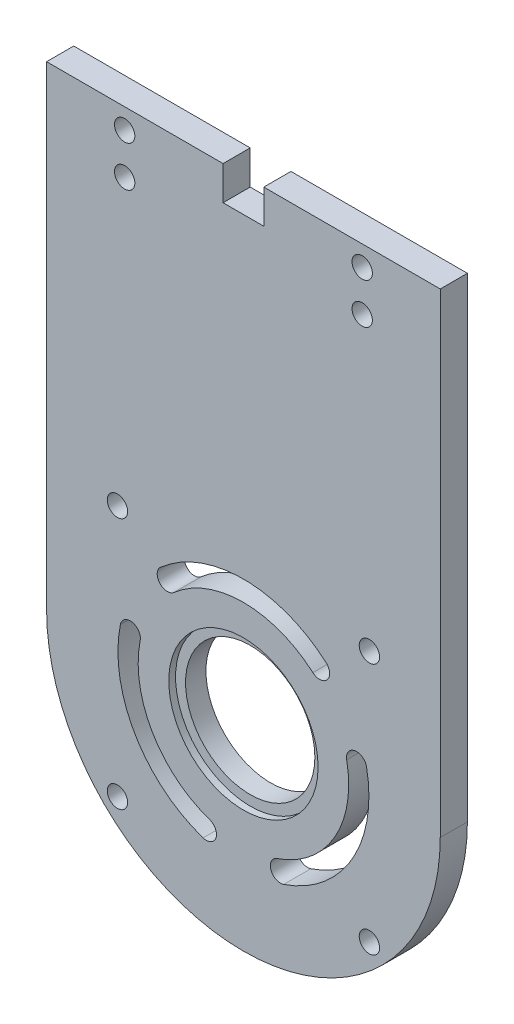
ISO-10303-21;
HEADER;
FILE_DESCRIPTION(('STEP AP214'),'2;1');
FILE_NAME('part.step','',(''),(''),'','','');
FILE_SCHEMA(('AUTOMOTIVE_DESIGN { 1 0 10303 214 1 1 1 1 }'));
ENDSEC;
DATA;
#1=APPLICATION_CONTEXT('core data for automotive mechanical design processes');
#2=APPLICATION_PROTOCOL_DEFINITION('international standard','automotive_design',2000,#1);
#3=PRODUCT_CONTEXT('',#1,'mechanical');
#4=PRODUCT('Part','Part','',(#3));
#5=PRODUCT_RELATED_PRODUCT_CATEGORY('part','',(#4));
#6=PRODUCT_DEFINITION_FORMATION('','',#4);
#7=PRODUCT_DEFINITION_CONTEXT('part definition',#1,'design');
#8=PRODUCT_DEFINITION('design','',#6,#7);
#9=PRODUCT_DEFINITION_SHAPE('','',#8);
#10=(LENGTH_UNIT() NAMED_UNIT(*) SI_UNIT(.MILLI.,.METRE.));
#11=(NAMED_UNIT(*) PLANE_ANGLE_UNIT() SI_UNIT($,.RADIAN.));
#12=(NAMED_UNIT(*) SI_UNIT($,.STERADIAN.) SOLID_ANGLE_UNIT());
#13=UNCERTAINTY_MEASURE_WITH_UNIT(LENGTH_MEASURE(1.E-05),#10,'distance_accuracy_value','');
#14=(GEOMETRIC_REPRESENTATION_CONTEXT(3) GLOBAL_UNCERTAINTY_ASSIGNED_CONTEXT((#13)) GLOBAL_UNIT_ASSIGNED_CONTEXT((#10,
#11,#12)) REPRESENTATION_CONTEXT('',''));
#15=CARTESIAN_POINT('',(0.,0.,0.));
#16=DIRECTION('',(0.,0.,1.));
#17=DIRECTION('',(1.,0.,0.));
#18=AXIS2_PLACEMENT_3D('',#15,#16,#17);
#19=CARTESIAN_POINT('',(0.,-64.,4.));
#20=DIRECTION('',(0.,0.,-1.));
#21=DIRECTION('',(-1.,0.,0.));
#22=AXIS2_PLACEMENT_3D('',#19,#20,#21);
#23=CYLINDRICAL_SURFACE('',#22,9.525);
#24=CARTESIAN_POINT('',(0.,-64.,0.));
#25=DIRECTION('',(0.,0.,1.));
#26=DIRECTION('',(1.,0.,0.));
#27=AXIS2_PLACEMENT_3D('',#24,#25,#26);
#28=CIRCLE('',#27,9.525);
#29=CARTESIAN_POINT('',(9.525,-64.,0.));
#30=VERTEX_POINT('',#29);
#31=EDGE_CURVE('E321',#30,#30,#28,.T.);
#32=ORIENTED_EDGE('',*,*,#31,.F.);
#33=EDGE_LOOP('',(#32));
#34=FACE_BOUND('',#33,.T.);
#35=CARTESIAN_POINT('',(0.,-64.,3.));
#36=DIRECTION('',(0.,0.,1.));
#37=DIRECTION('',(1.,0.,0.));
#38=AXIS2_PLACEMENT_3D('',#35,#36,#37);
#39=CIRCLE('',#38,9.525);
#40=CARTESIAN_POINT('',(9.525,-64.,3.));
#41=VERTEX_POINT('',#40);
#42=EDGE_CURVE('E47',#41,#41,#39,.T.);
#43=ORIENTED_EDGE('',*,*,#42,.T.);
#44=EDGE_LOOP('',(#43));
#45=FACE_BOUND('',#44,.T.);
#46=ADVANCED_FACE('F44',(#34,#45),#23,.F.);
#47=CARTESIAN_POINT('',(0.,6.,4.));
#48=DIRECTION('',(0.,1.,0.));
#49=DIRECTION('',(0.,0.,1.));
#50=AXIS2_PLACEMENT_3D('',#47,#48,#49);
#51=PLANE('',#50);
#52=DIRECTION('',(0.,0.,1.));
#53=VECTOR('',#52,1.);
#54=CARTESIAN_POINT('',(-3.,6.,0.));
#55=LINE('',#54,#53);
#56=CARTESIAN_POINT('',(-3.,6.,0.));
#57=VERTEX_POINT('',#56);
#58=CARTESIAN_POINT('',(-3.,6.,4.));
#59=VERTEX_POINT('',#58);
#60=EDGE_CURVE('E275',#57,#59,#55,.T.);
#61=ORIENTED_EDGE('',*,*,#60,.F.);
#62=DIRECTION('',(1.,0.,0.));
#63=VECTOR('',#62,1.);
#64=CARTESIAN_POINT('',(0.,6.,0.));
#65=LINE('',#64,#63);
#66=CARTESIAN_POINT('',(-29.,6.,0.));
#67=VERTEX_POINT('',#66);
#68=EDGE_CURVE('E340',#67,#57,#65,.T.);
#69=ORIENTED_EDGE('',*,*,#68,.F.);
#70=DIRECTION('',(0.,0.,-1.));
#71=VECTOR('',#70,1.);
#72=CARTESIAN_POINT('',(-29.,6.,4.));
#73=LINE('',#72,#71);
#74=CARTESIAN_POINT('',(-29.,6.,4.));
#75=VERTEX_POINT('',#74);
#76=EDGE_CURVE('E319',#75,#67,#73,.T.);
#77=ORIENTED_EDGE('',*,*,#76,.F.);
#78=DIRECTION('',(1.,0.,0.));
#79=VECTOR('',#78,1.);
#80=CARTESIAN_POINT('',(0.,6.,4.));
#81=LINE('',#80,#79);
#82=EDGE_CURVE('E300',#75,#59,#81,.T.);
#83=ORIENTED_EDGE('',*,*,#82,.T.);
#84=EDGE_LOOP('',(#61,#69,#77,#83));
#85=FACE_BOUND('',#84,.T.);
#86=ADVANCED_FACE('F414',(#85),#51,.T.);
#87=CARTESIAN_POINT('',(-29.,0.,4.));
#88=DIRECTION('',(1.,0.,0.));
#89=DIRECTION('',(0.,1.,0.));
#90=AXIS2_PLACEMENT_3D('',#87,#88,#89);
#91=PLANE('',#90);
#92=DIRECTION('',(0.,-1.,0.));
#93=VECTOR('',#92,1.);
#94=CARTESIAN_POINT('',(-29.,0.,0.));
#95=LINE('',#94,#93);
#96=CARTESIAN_POINT('',(-29.,-64.,0.));
#97=VERTEX_POINT('',#96);
#98=EDGE_CURVE('E330',#67,#97,#95,.T.);
#99=ORIENTED_EDGE('',*,*,#98,.T.);
#100=DIRECTION('',(0.,0.,-1.));
#101=VECTOR('',#100,1.);
#102=CARTESIAN_POINT('',(-29.,-64.,4.));
#103=LINE('',#102,#101);
#104=CARTESIAN_POINT('',(-29.,-64.,4.));
#105=VERTEX_POINT('',#104);
#106=EDGE_CURVE('E361',#105,#97,#103,.T.);
#107=ORIENTED_EDGE('',*,*,#106,.F.);
#108=DIRECTION('',(0.,-1.,0.));
#109=VECTOR('',#108,1.);
#110=CARTESIAN_POINT('',(-29.,0.,4.));
#111=LINE('',#110,#109);
#112=EDGE_CURVE('E290',#75,#105,#111,.T.);
#113=ORIENTED_EDGE('',*,*,#112,.F.);
#114=ORIENTED_EDGE('',*,*,#76,.T.);
#115=EDGE_LOOP('',(#99,#107,#113,#114));
#116=FACE_BOUND('',#115,.T.);
#117=ADVANCED_FACE('F421',(#116),#91,.F.);
#118=CARTESIAN_POINT('',(0.,-64.,4.));
#119=DIRECTION('',(0.,0.,-1.));
#120=DIRECTION('',(-1.,0.,0.));
#121=AXIS2_PLACEMENT_3D('',#118,#119,#120);
#122=CYLINDRICAL_SURFACE('',#121,29.);
#123=CARTESIAN_POINT('',(0.,-64.,0.));
#124=DIRECTION('',(0.,0.,1.));
#125=DIRECTION('',(1.,0.,0.));
#126=AXIS2_PLACEMENT_3D('',#123,#124,#125);
#127=CIRCLE('',#126,29.);
#128=CARTESIAN_POINT('',(29.,-64.,0.));
#129=VERTEX_POINT('',#128);
#130=EDGE_CURVE('E329',#97,#129,#127,.T.);
#131=ORIENTED_EDGE('',*,*,#130,.T.);
#132=DIRECTION('',(0.,0.,-1.));
#133=VECTOR('',#132,1.);
#134=CARTESIAN_POINT('',(29.,-64.,4.));
#135=LINE('',#134,#133);
#136=CARTESIAN_POINT('',(29.,-64.,4.));
#137=VERTEX_POINT('',#136);
#138=EDGE_CURVE('E363',#137,#129,#135,.T.);
#139=ORIENTED_EDGE('',*,*,#138,.F.);
#140=CARTESIAN_POINT('',(0.,-64.,4.));
#141=DIRECTION('',(0.,0.,1.));
#142=DIRECTION('',(1.,0.,0.));
#143=AXIS2_PLACEMENT_3D('',#140,#141,#142);
#144=CIRCLE('',#143,29.);
#145=EDGE_CURVE('E293',#105,#137,#144,.T.);
#146=ORIENTED_EDGE('',*,*,#145,.F.);
#147=ORIENTED_EDGE('',*,*,#106,.T.);
#148=EDGE_LOOP('',(#131,#139,#146,#147));
#149=FACE_BOUND('',#148,.T.);
#150=ADVANCED_FACE('F491',(#149),#122,.T.);
#151=CARTESIAN_POINT('',(29.,0.,4.));
#152=DIRECTION('',(1.,0.,0.));
#153=DIRECTION('',(0.,1.,0.));
#154=AXIS2_PLACEMENT_3D('',#151,#152,#153);
#155=PLANE('',#154);
#156=DIRECTION('',(0.,-1.,0.));
#157=VECTOR('',#156,1.);
#158=CARTESIAN_POINT('',(29.,0.,0.));
#159=LINE('',#158,#157);
#160=CARTESIAN_POINT('',(29.,6.,0.));
#161=VERTEX_POINT('',#160);
#162=EDGE_CURVE('E335',#161,#129,#159,.T.);
#163=ORIENTED_EDGE('',*,*,#162,.F.);
#164=DIRECTION('',(0.,0.,-1.));
#165=VECTOR('',#164,1.);
#166=CARTESIAN_POINT('',(29.,6.,4.));
#167=LINE('',#166,#165);
#168=CARTESIAN_POINT('',(29.,6.,4.));
#169=VERTEX_POINT('',#168);
#170=EDGE_CURVE('E356',#169,#161,#167,.T.);
#171=ORIENTED_EDGE('',*,*,#170,.F.);
#172=DIRECTION('',(0.,-1.,0.));
#173=VECTOR('',#172,1.);
#174=CARTESIAN_POINT('',(29.,0.,4.));
#175=LINE('',#174,#173);
#176=EDGE_CURVE('E291',#169,#137,#175,.T.);
#177=ORIENTED_EDGE('',*,*,#176,.T.);
#178=ORIENTED_EDGE('',*,*,#138,.T.);
#179=EDGE_LOOP('',(#163,#171,#177,#178));
#180=FACE_BOUND('',#179,.T.);
#181=ADVANCED_FACE('F480',(#180),#155,.T.);
#182=CARTESIAN_POINT('',(-17.4999999999999,-3.,4.));
#183=DIRECTION('',(0.,0.,-1.));
#184=DIRECTION('',(-1.,0.,0.));
#185=AXIS2_PLACEMENT_3D('',#182,#183,#184);
#186=CYLINDRICAL_SURFACE('',#185,1.5);
#187=CARTESIAN_POINT('',(-17.4999999999999,-3.,4.));
#188=DIRECTION('',(0.,0.,1.));
#189=DIRECTION('',(1.,0.,0.));
#190=AXIS2_PLACEMENT_3D('',#187,#188,#189);
#191=CIRCLE('',#190,1.5);
#192=CARTESIAN_POINT('',(-15.9999999999999,-3.,4.));
#193=VERTEX_POINT('',#192);
#194=EDGE_CURVE('E315',#193,#193,#191,.T.);
#195=ORIENTED_EDGE('',*,*,#194,.T.);
#196=EDGE_LOOP('',(#195));
#197=FACE_BOUND('',#196,.T.);
#198=CARTESIAN_POINT('',(-17.4999999999999,-3.,0.));
#199=DIRECTION('',(0.,0.,1.));
#200=DIRECTION('',(1.,0.,0.));
#201=AXIS2_PLACEMENT_3D('',#198,#199,#200);
#202=CIRCLE('',#201,1.5);
#203=CARTESIAN_POINT('',(-15.9999999999999,-3.,0.));
#204=VERTEX_POINT('',#203);
#205=EDGE_CURVE('E354',#204,#204,#202,.T.);
#206=ORIENTED_EDGE('',*,*,#205,.F.);
#207=EDGE_LOOP('',(#206));
#208=FACE_BOUND('',#207,.T.);
#209=ADVANCED_FACE('F474',(#197,#208),#186,.F.);
#210=CARTESIAN_POINT('',(18.5615530061469,-45.4384469938532,4.));
#211=DIRECTION('',(0.,0.,-1.));
#212=DIRECTION('',(-1.,0.,0.));
#213=AXIS2_PLACEMENT_3D('',#210,#211,#212);
#214=CYLINDRICAL_SURFACE('',#213,1.5);
#215=CARTESIAN_POINT('',(18.5615530061469,-45.4384469938532,4.));
#216=DIRECTION('',(0.,0.,1.));
#217=DIRECTION('',(1.,0.,0.));
#218=AXIS2_PLACEMENT_3D('',#215,#216,#217);
#219=CIRCLE('',#218,1.5);
#220=CARTESIAN_POINT('',(20.0615530061469,-45.4384469938532,4.));
#221=VERTEX_POINT('',#220);
#222=EDGE_CURVE('E307',#221,#221,#219,.T.);
#223=ORIENTED_EDGE('',*,*,#222,.T.);
#224=EDGE_LOOP('',(#223));
#225=FACE_BOUND('',#224,.T.);
#226=CARTESIAN_POINT('',(18.5615530061469,-45.4384469938532,0.));
#227=DIRECTION('',(0.,0.,1.));
#228=DIRECTION('',(1.,0.,0.));
#229=AXIS2_PLACEMENT_3D('',#226,#227,#228);
#230=CIRCLE('',#229,1.5);
#231=CARTESIAN_POINT('',(20.0615530061469,-45.4384469938532,0.));
#232=VERTEX_POINT('',#231);
#233=EDGE_CURVE('E348',#232,#232,#230,.T.);
#234=ORIENTED_EDGE('',*,*,#233,.F.);
#235=EDGE_LOOP('',(#234));
#236=FACE_BOUND('',#235,.T.);
#237=ADVANCED_FACE('F476',(#225,#236),#214,.F.);
#238=CARTESIAN_POINT('',(-18.5615530061468,-45.4384469938531,4.));
#239=DIRECTION('',(0.,0.,-1.));
#240=DIRECTION('',(-1.,0.,0.));
#241=AXIS2_PLACEMENT_3D('',#238,#239,#240);
#242=CYLINDRICAL_SURFACE('',#241,1.5);
#243=CARTESIAN_POINT('',(-18.5615530061468,-45.4384469938531,4.));
#244=DIRECTION('',(0.,0.,1.));
#245=DIRECTION('',(1.,0.,0.));
#246=AXIS2_PLACEMENT_3D('',#243,#244,#245);
#247=CIRCLE('',#246,1.5);
#248=CARTESIAN_POINT('',(-17.0615530061468,-45.4384469938531,4.));
#249=VERTEX_POINT('',#248);
#250=EDGE_CURVE('E306',#249,#249,#247,.T.);
#251=ORIENTED_EDGE('',*,*,#250,.T.);
#252=EDGE_LOOP('',(#251));
#253=FACE_BOUND('',#252,.T.);
#254=CARTESIAN_POINT('',(-18.5615530061468,-45.4384469938531,0.));
#255=DIRECTION('',(0.,0.,1.));
#256=DIRECTION('',(1.,0.,0.));
#257=AXIS2_PLACEMENT_3D('',#254,#255,#256);
#258=CIRCLE('',#257,1.5);
#259=CARTESIAN_POINT('',(-17.0615530061468,-45.4384469938531,0.));
#260=VERTEX_POINT('',#259);
#261=EDGE_CURVE('E346',#260,#260,#258,.T.);
#262=ORIENTED_EDGE('',*,*,#261,.F.);
#263=EDGE_LOOP('',(#262));
#264=FACE_BOUND('',#263,.T.);
#265=ADVANCED_FACE('F482',(#253,#264),#242,.F.);
#266=CARTESIAN_POINT('',(-18.5615530061469,-82.5615530061468,4.));
#267=DIRECTION('',(0.,0.,-1.));
#268=DIRECTION('',(-1.,0.,0.));
#269=AXIS2_PLACEMENT_3D('',#266,#267,#268);
#270=CYLINDRICAL_SURFACE('',#269,1.49999999999999);
#271=CARTESIAN_POINT('',(-18.5615530061469,-82.5615530061468,4.));
#272=DIRECTION('',(0.,0.,1.));
#273=DIRECTION('',(1.,0.,0.));
#274=AXIS2_PLACEMENT_3D('',#271,#272,#273);
#275=CIRCLE('',#274,1.49999999999999);
#276=CARTESIAN_POINT('',(-17.0615530061469,-82.5615530061468,4.));
#277=VERTEX_POINT('',#276);
#278=EDGE_CURVE('E303',#277,#277,#275,.T.);
#279=ORIENTED_EDGE('',*,*,#278,.T.);
#280=EDGE_LOOP('',(#279));
#281=FACE_BOUND('',#280,.T.);
#282=CARTESIAN_POINT('',(-18.5615530061469,-82.5615530061468,0.));
#283=DIRECTION('',(0.,0.,1.));
#284=DIRECTION('',(1.,0.,0.));
#285=AXIS2_PLACEMENT_3D('',#282,#283,#284);
#286=CIRCLE('',#285,1.49999999999999);
#287=CARTESIAN_POINT('',(-17.0615530061469,-82.5615530061468,0.));
#288=VERTEX_POINT('',#287);
#289=EDGE_CURVE('E344',#288,#288,#286,.T.);
#290=ORIENTED_EDGE('',*,*,#289,.F.);
#291=EDGE_LOOP('',(#290));
#292=FACE_BOUND('',#291,.T.);
#293=ADVANCED_FACE('F483',(#281,#292),#270,.F.);
#294=CARTESIAN_POINT('',(18.5615530061468,-82.5615530061469,4.));
#295=DIRECTION('',(0.,0.,-1.));
#296=DIRECTION('',(-1.,0.,0.));
#297=AXIS2_PLACEMENT_3D('',#294,#295,#296);
#298=CYLINDRICAL_SURFACE('',#297,1.50000000000001);
#299=CARTESIAN_POINT('',(18.5615530061468,-82.5615530061469,4.));
#300=DIRECTION('',(0.,0.,1.));
#301=DIRECTION('',(1.,0.,0.));
#302=AXIS2_PLACEMENT_3D('',#299,#300,#301);
#303=CIRCLE('',#302,1.50000000000001);
#304=CARTESIAN_POINT('',(20.0615530061469,-82.5615530061469,4.));
#305=VERTEX_POINT('',#304);
#306=EDGE_CURVE('E297',#305,#305,#303,.T.);
#307=ORIENTED_EDGE('',*,*,#306,.T.);
#308=EDGE_LOOP('',(#307));
#309=FACE_BOUND('',#308,.T.);
#310=CARTESIAN_POINT('',(18.5615530061468,-82.5615530061469,0.));
#311=DIRECTION('',(0.,0.,1.));
#312=DIRECTION('',(1.,0.,0.));
#313=AXIS2_PLACEMENT_3D('',#310,#311,#312);
#314=CIRCLE('',#313,1.50000000000001);
#315=CARTESIAN_POINT('',(20.0615530061469,-82.5615530061469,0.));
#316=VERTEX_POINT('',#315);
#317=EDGE_CURVE('E338',#316,#316,#314,.T.);
#318=ORIENTED_EDGE('',*,*,#317,.F.);
#319=EDGE_LOOP('',(#318));
#320=FACE_BOUND('',#319,.T.);
#321=ADVANCED_FACE('F441',(#309,#320),#298,.F.);
#322=DIRECTION('',(0.,0.,1.));
#323=VECTOR('',#322,1.);
#324=CARTESIAN_POINT('',(3.,6.,0.));
#325=LINE('',#324,#323);
#326=CARTESIAN_POINT('',(3.,6.,0.));
#327=VERTEX_POINT('',#326);
#328=CARTESIAN_POINT('',(3.,6.,4.));
#329=VERTEX_POINT('',#328);
#330=EDGE_CURVE('E273',#327,#329,#325,.T.);
#331=ORIENTED_EDGE('',*,*,#330,.T.);
#332=EDGE_CURVE('E298',#329,#169,#81,.T.);
#333=ORIENTED_EDGE('',*,*,#332,.T.);
#334=ORIENTED_EDGE('',*,*,#170,.T.);
#335=EDGE_CURVE('E337',#327,#161,#65,.T.);
#336=ORIENTED_EDGE('',*,*,#335,.F.);
#337=EDGE_LOOP('',(#331,#333,#334,#336));
#338=FACE_BOUND('',#337,.T.);
#339=ADVANCED_FACE('F428',(#338),#51,.T.);
#340=CARTESIAN_POINT('',(-17.5,3.,4.));
#341=DIRECTION('',(0.,0.,-1.));
#342=DIRECTION('',(-1.,0.,0.));
#343=AXIS2_PLACEMENT_3D('',#340,#341,#342);
#344=CYLINDRICAL_SURFACE('',#343,1.5);
#345=CARTESIAN_POINT('',(-17.5,3.,4.));
#346=DIRECTION('',(0.,0.,1.));
#347=DIRECTION('',(1.,0.,0.));
#348=AXIS2_PLACEMENT_3D('',#345,#346,#347);
#349=CIRCLE('',#348,1.5);
#350=CARTESIAN_POINT('',(-16.,3.,4.));
#351=VERTEX_POINT('',#350);
#352=EDGE_CURVE('E283',#351,#351,#349,.T.);
#353=ORIENTED_EDGE('',*,*,#352,.T.);
#354=EDGE_LOOP('',(#353));
#355=FACE_BOUND('',#354,.T.);
#356=CARTESIAN_POINT('',(-17.5,3.,0.));
#357=DIRECTION('',(0.,0.,1.));
#358=DIRECTION('',(1.,0.,0.));
#359=AXIS2_PLACEMENT_3D('',#356,#357,#358);
#360=CIRCLE('',#359,1.5);
#361=CARTESIAN_POINT('',(-16.,3.,0.));
#362=VERTEX_POINT('',#361);
#363=EDGE_CURVE('E322',#362,#362,#360,.T.);
#364=ORIENTED_EDGE('',*,*,#363,.F.);
#365=EDGE_LOOP('',(#364));
#366=FACE_BOUND('',#365,.T.);
#367=ADVANCED_FACE('F431',(#355,#366),#344,.F.);
#368=CARTESIAN_POINT('',(17.5,3.,4.));
#369=DIRECTION('',(0.,0.,-1.));
#370=DIRECTION('',(-1.,0.,0.));
#371=AXIS2_PLACEMENT_3D('',#368,#369,#370);
#372=CYLINDRICAL_SURFACE('',#371,1.5);
#373=CARTESIAN_POINT('',(17.5,3.,4.));
#374=DIRECTION('',(0.,0.,1.));
#375=DIRECTION('',(1.,0.,0.));
#376=AXIS2_PLACEMENT_3D('',#373,#374,#375);
#377=CIRCLE('',#376,1.5);
#378=CARTESIAN_POINT('',(19.,3.,4.));
#379=VERTEX_POINT('',#378);
#380=EDGE_CURVE('E281',#379,#379,#377,.F.);
#381=ORIENTED_EDGE('',*,*,#380,.F.);
#382=EDGE_LOOP('',(#381));
#383=FACE_BOUND('',#382,.T.);
#384=CARTESIAN_POINT('',(17.5,3.,0.));
#385=DIRECTION('',(0.,0.,1.));
#386=DIRECTION('',(1.,0.,0.));
#387=AXIS2_PLACEMENT_3D('',#384,#385,#386);
#388=CIRCLE('',#387,1.5);
#389=CARTESIAN_POINT('',(19.,3.,0.));
#390=VERTEX_POINT('',#389);
#391=EDGE_CURVE('E274',#390,#390,#388,.F.);
#392=ORIENTED_EDGE('',*,*,#391,.T.);
#393=EDGE_LOOP('',(#392));
#394=FACE_BOUND('',#393,.T.);
#395=ADVANCED_FACE('F50',(#383,#394),#372,.F.);
#396=CARTESIAN_POINT('',(17.5000000000001,-3.,4.));
#397=DIRECTION('',(0.,0.,-1.));
#398=DIRECTION('',(-1.,0.,0.));
#399=AXIS2_PLACEMENT_3D('',#396,#397,#398);
#400=CYLINDRICAL_SURFACE('',#399,1.5);
#401=CARTESIAN_POINT('',(17.5000000000001,-3.,4.));
#402=DIRECTION('',(0.,0.,1.));
#403=DIRECTION('',(1.,0.,0.));
#404=AXIS2_PLACEMENT_3D('',#401,#402,#403);
#405=CIRCLE('',#404,1.5);
#406=CARTESIAN_POINT('',(19.0000000000001,-3.,4.));
#407=VERTEX_POINT('',#406);
#408=EDGE_CURVE('E314',#407,#407,#405,.F.);
#409=ORIENTED_EDGE('',*,*,#408,.F.);
#410=EDGE_LOOP('',(#409));
#411=FACE_BOUND('',#410,.T.);
#412=CARTESIAN_POINT('',(17.5000000000001,-3.,0.));
#413=DIRECTION('',(0.,0.,1.));
#414=DIRECTION('',(1.,0.,0.));
#415=AXIS2_PLACEMENT_3D('',#412,#413,#414);
#416=CIRCLE('',#415,1.5);
#417=CARTESIAN_POINT('',(19.0000000000001,-3.,0.));
#418=VERTEX_POINT('',#417);
#419=EDGE_CURVE('E284',#418,#418,#416,.F.);
#420=ORIENTED_EDGE('',*,*,#419,.T.);
#421=EDGE_LOOP('',(#420));
#422=FACE_BOUND('',#421,.T.);
#423=ADVANCED_FACE('F438',(#411,#422),#400,.F.);
#424=CARTESIAN_POINT('',(0.,0.,4.));
#425=DIRECTION('',(0.,0.,1.));
#426=DIRECTION('',(1.,0.,0.));
#427=AXIS2_PLACEMENT_3D('',#424,#425,#426);
#428=PLANE('',#427);
#429=CARTESIAN_POINT('',(0.,-64.,4.));
#430=DIRECTION('',(0.,0.,1.));
#431=DIRECTION('',(1.,0.,0.));
#432=AXIS2_PLACEMENT_3D('',#429,#430,#431);
#433=CIRCLE('',#432,11.);
#434=CARTESIAN_POINT('',(11.,-64.,4.));
#435=VERTEX_POINT('',#434);
#436=EDGE_CURVE('E652',#435,#435,#433,.T.);
#437=ORIENTED_EDGE('',*,*,#436,.F.);
#438=EDGE_LOOP('',(#437));
#439=FACE_BOUND('',#438,.T.);
#440=CARTESIAN_POINT('',(11.2135824426123,-51.2228497385866,4.));
#441=DIRECTION('',(0.,0.,1.));
#442=DIRECTION('',(1.,0.,0.));
#443=AXIS2_PLACEMENT_3D('',#440,#441,#442);
#444=CIRCLE('',#443,1.48958473448185);
#445=CARTESIAN_POINT('',(10.23101884112,-52.3424172667973,4.));
#446=VERTEX_POINT('',#445);
#447=CARTESIAN_POINT('',(12.1961460441046,-50.1032822103759,4.));
#448=VERTEX_POINT('',#447);
#449=EDGE_CURVE('E62',#446,#448,#444,.T.);
#450=ORIENTED_EDGE('',*,*,#449,.F.);
#451=CARTESIAN_POINT('',(0.,-64.,4.));
#452=DIRECTION('',(0.,0.,-1.));
#453=DIRECTION('',(1.,0.,0.));
#454=AXIS2_PLACEMENT_3D('',#451,#452,#453);
#455=CIRCLE('',#454,15.5104152655182);
#456=CARTESIAN_POINT('',(-10.23101884112,-52.3424172667973,4.));
#457=VERTEX_POINT('',#456);
#458=EDGE_CURVE('E210',#457,#446,#455,.T.);
#459=ORIENTED_EDGE('',*,*,#458,.F.);
#460=CARTESIAN_POINT('',(-11.2135824426123,-51.2228497385866,4.));
#461=DIRECTION('',(0.,0.,1.));
#462=DIRECTION('',(1.,0.,0.));
#463=AXIS2_PLACEMENT_3D('',#460,#461,#462);
#464=CIRCLE('',#463,1.48958473448185);
#465=CARTESIAN_POINT('',(-12.1961460441046,-50.1032822103759,4.));
#466=VERTEX_POINT('',#465);
#467=EDGE_CURVE('E188',#466,#457,#464,.T.);
#468=ORIENTED_EDGE('',*,*,#467,.F.);
#469=CARTESIAN_POINT('',(0.,-64.,4.));
#470=DIRECTION('',(0.,0.,1.));
#471=DIRECTION('',(1.,0.,0.));
#472=AXIS2_PLACEMENT_3D('',#469,#470,#471);
#473=CIRCLE('',#472,18.4895847344819);
#474=EDGE_CURVE('E199',#448,#466,#473,.T.);
#475=ORIENTED_EDGE('',*,*,#474,.F.);
#476=EDGE_LOOP('',(#450,#459,#468,#475));
#477=FACE_BOUND('',#476,.T.);
#478=CARTESIAN_POINT('',(5.45854549304885,-80.0998223934401,4.));
#479=DIRECTION('',(0.,0.,1.));
#480=DIRECTION('',(1.,0.,0.));
#481=AXIS2_PLACEMENT_3D('',#478,#479,#480);
#482=CIRCLE('',#481,1.48958473448186);
#483=CARTESIAN_POINT('',(4.98025337311236,-78.6891135896085,4.));
#484=VERTEX_POINT('',#483);
#485=CARTESIAN_POINT('',(5.93683761298532,-81.5105311972718,4.));
#486=VERTEX_POINT('',#485);
#487=EDGE_CURVE('E68',#484,#486,#482,.T.);
#488=ORIENTED_EDGE('',*,*,#487,.F.);
#489=CARTESIAN_POINT('',(0.,-64.,4.));
#490=DIRECTION('',(0.,0.,-1.));
#491=DIRECTION('',(1.,0.,0.));
#492=AXIS2_PLACEMENT_3D('',#489,#490,#491);
#493=CIRCLE('',#492,15.5104152655181);
#494=CARTESIAN_POINT('',(15.2112722142324,-60.9684691435942,4.));
#495=VERTEX_POINT('',#494);
#496=EDGE_CURVE('E218',#495,#484,#493,.T.);
#497=ORIENTED_EDGE('',*,*,#496,.F.);
#498=CARTESIAN_POINT('',(16.6721279356612,-60.6773278679733,4.));
#499=DIRECTION('',(0.,0.,1.));
#500=DIRECTION('',(1.,0.,0.));
#501=AXIS2_PLACEMENT_3D('',#498,#499,#500);
#502=CIRCLE('',#501,1.48958473448185);
#503=CARTESIAN_POINT('',(18.1329836570899,-60.3861865923524,4.));
#504=VERTEX_POINT('',#503);
#505=EDGE_CURVE('E230',#504,#495,#502,.T.);
#506=ORIENTED_EDGE('',*,*,#505,.F.);
#507=CARTESIAN_POINT('',(0.,-64.,4.));
#508=DIRECTION('',(0.,0.,1.));
#509=DIRECTION('',(1.,0.,0.));
#510=AXIS2_PLACEMENT_3D('',#507,#508,#509);
#511=CIRCLE('',#510,18.4895847344819);
#512=EDGE_CURVE('E235',#486,#504,#511,.T.);
#513=ORIENTED_EDGE('',*,*,#512,.F.);
#514=EDGE_LOOP('',(#488,#497,#506,#513));
#515=FACE_BOUND('',#514,.T.);
#516=CARTESIAN_POINT('',(-16.6721279356612,-60.6773278679733,4.));
#517=DIRECTION('',(0.,0.,1.));
#518=DIRECTION('',(1.,0.,0.));
#519=AXIS2_PLACEMENT_3D('',#516,#517,#518);
#520=CIRCLE('',#519,1.48958473448185);
#521=CARTESIAN_POINT('',(-15.2112722142324,-60.9684691435942,4.));
#522=VERTEX_POINT('',#521);
#523=CARTESIAN_POINT('',(-18.1329836570899,-60.3861865923524,4.));
#524=VERTEX_POINT('',#523);
#525=EDGE_CURVE('E228',#522,#524,#520,.T.);
#526=ORIENTED_EDGE('',*,*,#525,.F.);
#527=CARTESIAN_POINT('',(0.,-64.,4.));
#528=DIRECTION('',(0.,0.,-1.));
#529=DIRECTION('',(1.,0.,0.));
#530=AXIS2_PLACEMENT_3D('',#527,#528,#529);
#531=CIRCLE('',#530,15.5104152655182);
#532=CARTESIAN_POINT('',(-4.98025337311235,-78.6891135896085,4.));
#533=VERTEX_POINT('',#532);
#534=EDGE_CURVE('E237',#533,#522,#531,.T.);
#535=ORIENTED_EDGE('',*,*,#534,.F.);
#536=CARTESIAN_POINT('',(-5.45854549304883,-80.0998223934401,4.));
#537=DIRECTION('',(0.,0.,1.));
#538=DIRECTION('',(1.,0.,0.));
#539=AXIS2_PLACEMENT_3D('',#536,#537,#538);
#540=CIRCLE('',#539,1.48958473448186);
#541=CARTESIAN_POINT('',(-5.93683761298531,-81.5105311972718,4.));
#542=VERTEX_POINT('',#541);
#543=EDGE_CURVE('E247',#542,#533,#540,.T.);
#544=ORIENTED_EDGE('',*,*,#543,.F.);
#545=CARTESIAN_POINT('',(0.,-64.,4.));
#546=DIRECTION('',(0.,0.,1.));
#547=DIRECTION('',(1.,0.,0.));
#548=AXIS2_PLACEMENT_3D('',#545,#546,#547);
#549=CIRCLE('',#548,18.4895847344819);
#550=EDGE_CURVE('E252',#524,#542,#549,.T.);
#551=ORIENTED_EDGE('',*,*,#550,.F.);
#552=EDGE_LOOP('',(#526,#535,#544,#551));
#553=FACE_BOUND('',#552,.T.);
#554=DIRECTION('',(0.,-1.,0.));
#555=VECTOR('',#554,1.);
#556=CARTESIAN_POINT('',(-3.,6.,4.));
#557=LINE('',#556,#555);
#558=CARTESIAN_POINT('',(-3.,0.999999999999997,4.));
#559=VERTEX_POINT('',#558);
#560=EDGE_CURVE('E211',#59,#559,#557,.T.);
#561=ORIENTED_EDGE('',*,*,#560,.F.);
#562=ORIENTED_EDGE('',*,*,#82,.F.);
#563=ORIENTED_EDGE('',*,*,#112,.T.);
#564=ORIENTED_EDGE('',*,*,#145,.T.);
#565=ORIENTED_EDGE('',*,*,#176,.F.);
#566=ORIENTED_EDGE('',*,*,#332,.F.);
#567=DIRECTION('',(0.,1.,0.));
#568=VECTOR('',#567,1.);
#569=CARTESIAN_POINT('',(3.,6.,4.));
#570=LINE('',#569,#568);
#571=CARTESIAN_POINT('',(3.,0.999999999999997,4.));
#572=VERTEX_POINT('',#571);
#573=EDGE_CURVE('E256',#572,#329,#570,.T.);
#574=ORIENTED_EDGE('',*,*,#573,.F.);
#575=DIRECTION('',(1.,0.,0.));
#576=VECTOR('',#575,1.);
#577=CARTESIAN_POINT('',(-3.,0.999999999999997,4.));
#578=LINE('',#577,#576);
#579=EDGE_CURVE('E270',#559,#572,#578,.T.);
#580=ORIENTED_EDGE('',*,*,#579,.F.);
#581=EDGE_LOOP('',(#561,#562,#563,#564,#565,#566,#574,#580));
#582=FACE_BOUND('',#581,.T.);
#583=ORIENTED_EDGE('',*,*,#380,.T.);
#584=EDGE_LOOP('',(#583));
#585=FACE_BOUND('',#584,.T.);
#586=ORIENTED_EDGE('',*,*,#352,.F.);
#587=EDGE_LOOP('',(#586));
#588=FACE_BOUND('',#587,.T.);
#589=ORIENTED_EDGE('',*,*,#306,.F.);
#590=EDGE_LOOP('',(#589));
#591=FACE_BOUND('',#590,.T.);
#592=ORIENTED_EDGE('',*,*,#278,.F.);
#593=EDGE_LOOP('',(#592));
#594=FACE_BOUND('',#593,.T.);
#595=ORIENTED_EDGE('',*,*,#250,.F.);
#596=EDGE_LOOP('',(#595));
#597=FACE_BOUND('',#596,.T.);
#598=ORIENTED_EDGE('',*,*,#222,.F.);
#599=EDGE_LOOP('',(#598));
#600=FACE_BOUND('',#599,.T.);
#601=ORIENTED_EDGE('',*,*,#194,.F.);
#602=EDGE_LOOP('',(#601));
#603=FACE_BOUND('',#602,.T.);
#604=ORIENTED_EDGE('',*,*,#408,.T.);
#605=EDGE_LOOP('',(#604));
#606=FACE_BOUND('',#605,.T.);
#607=ADVANCED_FACE('F201',(#439,#477,#515,#553,#582,#585,#588,#591,#594,#597,#600,#603,#606),
#428,.T.);
#608=CARTESIAN_POINT('',(0.,0.,0.));
#609=DIRECTION('',(0.,0.,1.));
#610=DIRECTION('',(1.,0.,0.));
#611=AXIS2_PLACEMENT_3D('',#608,#609,#610);
#612=PLANE('',#611);
#613=CARTESIAN_POINT('',(0.,-64.,0.));
#614=DIRECTION('',(0.,0.,1.));
#615=DIRECTION('',(1.,0.,0.));
#616=AXIS2_PLACEMENT_3D('',#613,#614,#615);
#617=CIRCLE('',#616,15.5104152655182);
#618=CARTESIAN_POINT('',(-10.23101884112,-52.3424172667973,0.));
#619=VERTEX_POINT('',#618);
#620=CARTESIAN_POINT('',(10.23101884112,-52.3424172667973,0.));
#621=VERTEX_POINT('',#620);
#622=EDGE_CURVE('E53',#619,#621,#617,.F.);
#623=ORIENTED_EDGE('',*,*,#622,.T.);
#624=CARTESIAN_POINT('',(11.2135824426123,-51.2228497385866,0.));
#625=DIRECTION('',(0.,0.,1.));
#626=DIRECTION('',(1.,0.,0.));
#627=AXIS2_PLACEMENT_3D('',#624,#625,#626);
#628=CIRCLE('',#627,1.48958473448185);
#629=CARTESIAN_POINT('',(12.1961460441046,-50.1032822103759,0.));
#630=VERTEX_POINT('',#629);
#631=EDGE_CURVE('E11',#621,#630,#628,.T.);
#632=ORIENTED_EDGE('',*,*,#631,.T.);
#633=CARTESIAN_POINT('',(0.,-64.,0.));
#634=DIRECTION('',(0.,0.,1.));
#635=DIRECTION('',(1.,0.,0.));
#636=AXIS2_PLACEMENT_3D('',#633,#634,#635);
#637=CIRCLE('',#636,18.4895847344819);
#638=CARTESIAN_POINT('',(-12.1961460441046,-50.1032822103759,0.));
#639=VERTEX_POINT('',#638);
#640=EDGE_CURVE('E388',#630,#639,#637,.T.);
#641=ORIENTED_EDGE('',*,*,#640,.T.);
#642=CARTESIAN_POINT('',(-11.2135824426123,-51.2228497385866,0.));
#643=DIRECTION('',(0.,0.,1.));
#644=DIRECTION('',(1.,0.,0.));
#645=AXIS2_PLACEMENT_3D('',#642,#643,#644);
#646=CIRCLE('',#645,1.48958473448185);
#647=EDGE_CURVE('E194',#639,#619,#646,.T.);
#648=ORIENTED_EDGE('',*,*,#647,.T.);
#649=EDGE_LOOP('',(#623,#632,#641,#648));
#650=FACE_BOUND('',#649,.T.);
#651=CARTESIAN_POINT('',(0.,-64.,0.));
#652=DIRECTION('',(0.,0.,1.));
#653=DIRECTION('',(1.,0.,0.));
#654=AXIS2_PLACEMENT_3D('',#651,#652,#653);
#655=CIRCLE('',#654,15.5104152655181);
#656=CARTESIAN_POINT('',(15.2112722142324,-60.9684691435942,0.));
#657=VERTEX_POINT('',#656);
#658=CARTESIAN_POINT('',(4.98025337311236,-78.6891135896085,0.));
#659=VERTEX_POINT('',#658);
#660=EDGE_CURVE('E381',#657,#659,#655,.F.);
#661=ORIENTED_EDGE('',*,*,#660,.T.);
#662=CARTESIAN_POINT('',(5.45854549304885,-80.0998223934401,0.));
#663=DIRECTION('',(0.,0.,1.));
#664=DIRECTION('',(1.,0.,0.));
#665=AXIS2_PLACEMENT_3D('',#662,#663,#664);
#666=CIRCLE('',#665,1.48958473448186);
#667=CARTESIAN_POINT('',(5.93683761298532,-81.5105311972718,0.));
#668=VERTEX_POINT('',#667);
#669=EDGE_CURVE('E390',#659,#668,#666,.T.);
#670=ORIENTED_EDGE('',*,*,#669,.T.);
#671=CARTESIAN_POINT('',(0.,-64.,0.));
#672=DIRECTION('',(0.,0.,1.));
#673=DIRECTION('',(1.,0.,0.));
#674=AXIS2_PLACEMENT_3D('',#671,#672,#673);
#675=CIRCLE('',#674,18.4895847344819);
#676=CARTESIAN_POINT('',(18.1329836570899,-60.3861865923524,0.));
#677=VERTEX_POINT('',#676);
#678=EDGE_CURVE('E377',#668,#677,#675,.T.);
#679=ORIENTED_EDGE('',*,*,#678,.T.);
#680=CARTESIAN_POINT('',(16.6721279356612,-60.6773278679733,0.));
#681=DIRECTION('',(0.,0.,1.));
#682=DIRECTION('',(1.,0.,0.));
#683=AXIS2_PLACEMENT_3D('',#680,#681,#682);
#684=CIRCLE('',#683,1.48958473448185);
#685=EDGE_CURVE('E382',#677,#657,#684,.T.);
#686=ORIENTED_EDGE('',*,*,#685,.T.);
#687=EDGE_LOOP('',(#661,#670,#679,#686));
#688=FACE_BOUND('',#687,.T.);
#689=CARTESIAN_POINT('',(0.,-64.,0.));
#690=DIRECTION('',(0.,0.,1.));
#691=DIRECTION('',(1.,0.,0.));
#692=AXIS2_PLACEMENT_3D('',#689,#690,#691);
#693=CIRCLE('',#692,15.5104152655182);
#694=CARTESIAN_POINT('',(-4.98025337311235,-78.6891135896085,0.));
#695=VERTEX_POINT('',#694);
#696=CARTESIAN_POINT('',(-15.2112722142324,-60.9684691435942,0.));
#697=VERTEX_POINT('',#696);
#698=EDGE_CURVE('E375',#695,#697,#693,.F.);
#699=ORIENTED_EDGE('',*,*,#698,.T.);
#700=CARTESIAN_POINT('',(-16.6721279356612,-60.6773278679733,0.));
#701=DIRECTION('',(0.,0.,1.));
#702=DIRECTION('',(1.,0.,0.));
#703=AXIS2_PLACEMENT_3D('',#700,#701,#702);
#704=CIRCLE('',#703,1.48958473448185);
#705=CARTESIAN_POINT('',(-18.1329836570899,-60.3861865923524,0.));
#706=VERTEX_POINT('',#705);
#707=EDGE_CURVE('E374',#697,#706,#704,.T.);
#708=ORIENTED_EDGE('',*,*,#707,.T.);
#709=CARTESIAN_POINT('',(0.,-64.,0.));
#710=DIRECTION('',(0.,0.,1.));
#711=DIRECTION('',(1.,0.,0.));
#712=AXIS2_PLACEMENT_3D('',#709,#710,#711);
#713=CIRCLE('',#712,18.4895847344819);
#714=CARTESIAN_POINT('',(-5.93683761298531,-81.5105311972718,0.));
#715=VERTEX_POINT('',#714);
#716=EDGE_CURVE('E366',#706,#715,#713,.T.);
#717=ORIENTED_EDGE('',*,*,#716,.T.);
#718=CARTESIAN_POINT('',(-5.45854549304883,-80.0998223934401,0.));
#719=DIRECTION('',(0.,0.,1.));
#720=DIRECTION('',(1.,0.,0.));
#721=AXIS2_PLACEMENT_3D('',#718,#719,#720);
#722=CIRCLE('',#721,1.48958473448186);
#723=EDGE_CURVE('E367',#715,#695,#722,.T.);
#724=ORIENTED_EDGE('',*,*,#723,.T.);
#725=EDGE_LOOP('',(#699,#708,#717,#724));
#726=FACE_BOUND('',#725,.T.);
#727=ORIENTED_EDGE('',*,*,#68,.T.);
#728=DIRECTION('',(0.,-1.,0.));
#729=VECTOR('',#728,1.);
#730=CARTESIAN_POINT('',(-3.,6.,0.));
#731=LINE('',#730,#729);
#732=CARTESIAN_POINT('',(-3.,0.999999999999997,0.));
#733=VERTEX_POINT('',#732);
#734=EDGE_CURVE('E253',#57,#733,#731,.T.);
#735=ORIENTED_EDGE('',*,*,#734,.T.);
#736=DIRECTION('',(1.,0.,0.));
#737=VECTOR('',#736,1.);
#738=CARTESIAN_POINT('',(-3.,0.999999999999997,0.));
#739=LINE('',#738,#737);
#740=CARTESIAN_POINT('',(3.,0.999999999999997,0.));
#741=VERTEX_POINT('',#740);
#742=EDGE_CURVE('E259',#733,#741,#739,.T.);
#743=ORIENTED_EDGE('',*,*,#742,.T.);
#744=DIRECTION('',(0.,1.,0.));
#745=VECTOR('',#744,1.);
#746=CARTESIAN_POINT('',(3.,6.,0.));
#747=LINE('',#746,#745);
#748=EDGE_CURVE('E265',#741,#327,#747,.T.);
#749=ORIENTED_EDGE('',*,*,#748,.T.);
#750=ORIENTED_EDGE('',*,*,#335,.T.);
#751=ORIENTED_EDGE('',*,*,#162,.T.);
#752=ORIENTED_EDGE('',*,*,#130,.F.);
#753=ORIENTED_EDGE('',*,*,#98,.F.);
#754=EDGE_LOOP('',(#727,#735,#743,#749,#750,#751,#752,#753));
#755=FACE_BOUND('',#754,.T.);
#756=ORIENTED_EDGE('',*,*,#391,.F.);
#757=EDGE_LOOP('',(#756));
#758=FACE_BOUND('',#757,.T.);
#759=ORIENTED_EDGE('',*,*,#363,.T.);
#760=EDGE_LOOP('',(#759));
#761=FACE_BOUND('',#760,.T.);
#762=ORIENTED_EDGE('',*,*,#31,.T.);
#763=EDGE_LOOP('',(#762));
#764=FACE_BOUND('',#763,.T.);
#765=ORIENTED_EDGE('',*,*,#317,.T.);
#766=EDGE_LOOP('',(#765));
#767=FACE_BOUND('',#766,.T.);
#768=ORIENTED_EDGE('',*,*,#289,.T.);
#769=EDGE_LOOP('',(#768));
#770=FACE_BOUND('',#769,.T.);
#771=ORIENTED_EDGE('',*,*,#261,.T.);
#772=EDGE_LOOP('',(#771));
#773=FACE_BOUND('',#772,.T.);
#774=ORIENTED_EDGE('',*,*,#233,.T.);
#775=EDGE_LOOP('',(#774));
#776=FACE_BOUND('',#775,.T.);
#777=ORIENTED_EDGE('',*,*,#205,.T.);
#778=EDGE_LOOP('',(#777));
#779=FACE_BOUND('',#778,.T.);
#780=ORIENTED_EDGE('',*,*,#419,.F.);
#781=EDGE_LOOP('',(#780));
#782=FACE_BOUND('',#781,.T.);
#783=ADVANCED_FACE('F394',(#650,#688,#726,#755,#758,#761,#764,#767,#770,#773,#776,#779,#782),
#612,.F.);
#784=CARTESIAN_POINT('',(-3.,6.,0.));
#785=DIRECTION('',(-1.,0.,0.));
#786=DIRECTION('',(0.,-1.,0.));
#787=AXIS2_PLACEMENT_3D('',#784,#785,#786);
#788=PLANE('',#787);
#789=ORIENTED_EDGE('',*,*,#560,.T.);
#790=DIRECTION('',(0.,0.,1.));
#791=VECTOR('',#790,1.);
#792=CARTESIAN_POINT('',(-3.,0.999999999999997,0.));
#793=LINE('',#792,#791);
#794=EDGE_CURVE('E264',#733,#559,#793,.T.);
#795=ORIENTED_EDGE('',*,*,#794,.F.);
#796=ORIENTED_EDGE('',*,*,#734,.F.);
#797=ORIENTED_EDGE('',*,*,#60,.T.);
#798=EDGE_LOOP('',(#789,#795,#796,#797));
#799=FACE_BOUND('',#798,.T.);
#800=ADVANCED_FACE('F446',(#799),#788,.F.);
#801=CARTESIAN_POINT('',(3.,6.,0.));
#802=DIRECTION('',(1.,0.,0.));
#803=DIRECTION('',(0.,1.,0.));
#804=AXIS2_PLACEMENT_3D('',#801,#802,#803);
#805=PLANE('',#804);
#806=ORIENTED_EDGE('',*,*,#573,.T.);
#807=ORIENTED_EDGE('',*,*,#330,.F.);
#808=ORIENTED_EDGE('',*,*,#748,.F.);
#809=DIRECTION('',(0.,0.,1.));
#810=VECTOR('',#809,1.);
#811=CARTESIAN_POINT('',(3.,0.999999999999997,0.));
#812=LINE('',#811,#810);
#813=EDGE_CURVE('E279',#741,#572,#812,.T.);
#814=ORIENTED_EDGE('',*,*,#813,.T.);
#815=EDGE_LOOP('',(#806,#807,#808,#814));
#816=FACE_BOUND('',#815,.T.);
#817=ADVANCED_FACE('F527',(#816),#805,.F.);
#818=CARTESIAN_POINT('',(-3.,0.999999999999997,0.));
#819=DIRECTION('',(0.,-1.,0.));
#820=DIRECTION('',(0.,0.,-1.));
#821=AXIS2_PLACEMENT_3D('',#818,#819,#820);
#822=PLANE('',#821);
#823=ORIENTED_EDGE('',*,*,#579,.T.);
#824=ORIENTED_EDGE('',*,*,#813,.F.);
#825=ORIENTED_EDGE('',*,*,#742,.F.);
#826=ORIENTED_EDGE('',*,*,#794,.T.);
#827=EDGE_LOOP('',(#823,#824,#825,#826));
#828=FACE_BOUND('',#827,.T.);
#829=ADVANCED_FACE('F522',(#828),#822,.F.);
#830=CARTESIAN_POINT('',(-16.6721279356612,-60.6773278679733,-6.));
#831=DIRECTION('',(0.,0.,1.));
#832=DIRECTION('',(1.,0.,0.));
#833=AXIS2_PLACEMENT_3D('',#830,#831,#832);
#834=CYLINDRICAL_SURFACE('',#833,1.48958473448185);
#835=DIRECTION('',(0.,0.,1.));
#836=VECTOR('',#835,1.);
#837=CARTESIAN_POINT('',(-15.2112722142324,-60.9684691435942,-6.));
#838=LINE('',#837,#836);
#839=EDGE_CURVE('E242',#697,#522,#838,.T.);
#840=ORIENTED_EDGE('',*,*,#839,.T.);
#841=ORIENTED_EDGE('',*,*,#525,.T.);
#842=DIRECTION('',(0.,0.,1.));
#843=VECTOR('',#842,1.);
#844=CARTESIAN_POINT('',(-18.1329836570899,-60.3861865923524,-6.));
#845=LINE('',#844,#843);
#846=EDGE_CURVE('E236',#706,#524,#845,.T.);
#847=ORIENTED_EDGE('',*,*,#846,.F.);
#848=ORIENTED_EDGE('',*,*,#707,.F.);
#849=EDGE_LOOP('',(#840,#841,#847,#848));
#850=FACE_BOUND('',#849,.T.);
#851=ADVANCED_FACE('F531',(#850),#834,.F.);
#852=CARTESIAN_POINT('',(0.,-64.,-6.));
#853=DIRECTION('',(0.,0.,1.));
#854=DIRECTION('',(1.,0.,0.));
#855=AXIS2_PLACEMENT_3D('',#852,#853,#854);
#856=CYLINDRICAL_SURFACE('',#855,15.5104152655182);
#857=DIRECTION('',(0.,0.,1.));
#858=VECTOR('',#857,1.);
#859=CARTESIAN_POINT('',(-4.98025337311235,-78.6891135896085,-6.));
#860=LINE('',#859,#858);
#861=EDGE_CURVE('E245',#695,#533,#860,.T.);
#862=ORIENTED_EDGE('',*,*,#861,.T.);
#863=ORIENTED_EDGE('',*,*,#534,.T.);
#864=ORIENTED_EDGE('',*,*,#839,.F.);
#865=ORIENTED_EDGE('',*,*,#698,.F.);
#866=EDGE_LOOP('',(#862,#863,#864,#865));
#867=FACE_BOUND('',#866,.T.);
#868=ADVANCED_FACE('F540',(#867),#856,.T.);
#869=CARTESIAN_POINT('',(-5.45854549304883,-80.0998223934401,-6.));
#870=DIRECTION('',(0.,0.,1.));
#871=DIRECTION('',(1.,0.,0.));
#872=AXIS2_PLACEMENT_3D('',#869,#870,#871);
#873=CYLINDRICAL_SURFACE('',#872,1.48958473448186);
#874=DIRECTION('',(0.,0.,1.));
#875=VECTOR('',#874,1.);
#876=CARTESIAN_POINT('',(-5.93683761298531,-81.5105311972718,-6.));
#877=LINE('',#876,#875);
#878=EDGE_CURVE('E239',#715,#542,#877,.T.);
#879=ORIENTED_EDGE('',*,*,#878,.T.);
#880=ORIENTED_EDGE('',*,*,#543,.T.);
#881=ORIENTED_EDGE('',*,*,#861,.F.);
#882=ORIENTED_EDGE('',*,*,#723,.F.);
#883=EDGE_LOOP('',(#879,#880,#881,#882));
#884=FACE_BOUND('',#883,.T.);
#885=ADVANCED_FACE('F538',(#884),#873,.F.);
#886=CARTESIAN_POINT('',(0.,-64.,-6.));
#887=DIRECTION('',(0.,0.,1.));
#888=DIRECTION('',(1.,0.,0.));
#889=AXIS2_PLACEMENT_3D('',#886,#887,#888);
#890=CYLINDRICAL_SURFACE('',#889,18.4895847344819);
#891=ORIENTED_EDGE('',*,*,#846,.T.);
#892=ORIENTED_EDGE('',*,*,#550,.T.);
#893=ORIENTED_EDGE('',*,*,#878,.F.);
#894=ORIENTED_EDGE('',*,*,#716,.F.);
#895=EDGE_LOOP('',(#891,#892,#893,#894));
#896=FACE_BOUND('',#895,.T.);
#897=ADVANCED_FACE('F543',(#896),#890,.F.);
#898=CARTESIAN_POINT('',(5.45854549304885,-80.0998223934401,-6.));
#899=DIRECTION('',(0.,0.,1.));
#900=DIRECTION('',(1.,0.,0.));
#901=AXIS2_PLACEMENT_3D('',#898,#899,#900);
#902=CYLINDRICAL_SURFACE('',#901,1.48958473448186);
#903=DIRECTION('',(0.,0.,1.));
#904=VECTOR('',#903,1.);
#905=CARTESIAN_POINT('',(4.98025337311236,-78.6891135896085,-6.));
#906=LINE('',#905,#904);
#907=EDGE_CURVE('E221',#659,#484,#906,.T.);
#908=ORIENTED_EDGE('',*,*,#907,.T.);
#909=ORIENTED_EDGE('',*,*,#487,.T.);
#910=DIRECTION('',(0.,0.,1.));
#911=VECTOR('',#910,1.);
#912=CARTESIAN_POINT('',(5.93683761298532,-81.5105311972718,-6.));
#913=LINE('',#912,#911);
#914=EDGE_CURVE('E220',#668,#486,#913,.T.);
#915=ORIENTED_EDGE('',*,*,#914,.F.);
#916=ORIENTED_EDGE('',*,*,#669,.F.);
#917=EDGE_LOOP('',(#908,#909,#915,#916));
#918=FACE_BOUND('',#917,.T.);
#919=ADVANCED_FACE('F550',(#918),#902,.F.);
#920=CARTESIAN_POINT('',(0.,-64.,-6.));
#921=DIRECTION('',(0.,0.,1.));
#922=DIRECTION('',(1.,0.,0.));
#923=AXIS2_PLACEMENT_3D('',#920,#921,#922);
#924=CYLINDRICAL_SURFACE('',#923,15.5104152655181);
#925=DIRECTION('',(0.,0.,1.));
#926=VECTOR('',#925,1.);
#927=CARTESIAN_POINT('',(15.2112722142324,-60.9684691435942,-6.));
#928=LINE('',#927,#926);
#929=EDGE_CURVE('E224',#657,#495,#928,.T.);
#930=ORIENTED_EDGE('',*,*,#929,.T.);
#931=ORIENTED_EDGE('',*,*,#496,.T.);
#932=ORIENTED_EDGE('',*,*,#907,.F.);
#933=ORIENTED_EDGE('',*,*,#660,.F.);
#934=EDGE_LOOP('',(#930,#931,#932,#933));
#935=FACE_BOUND('',#934,.T.);
#936=ADVANCED_FACE('F551',(#935),#924,.T.);
#937=CARTESIAN_POINT('',(16.6721279356612,-60.6773278679733,-6.));
#938=DIRECTION('',(0.,0.,1.));
#939=DIRECTION('',(1.,0.,0.));
#940=AXIS2_PLACEMENT_3D('',#937,#938,#939);
#941=CYLINDRICAL_SURFACE('',#940,1.48958473448185);
#942=DIRECTION('',(0.,0.,1.));
#943=VECTOR('',#942,1.);
#944=CARTESIAN_POINT('',(18.1329836570899,-60.3861865923524,-6.));
#945=LINE('',#944,#943);
#946=EDGE_CURVE('E219',#677,#504,#945,.T.);
#947=ORIENTED_EDGE('',*,*,#946,.T.);
#948=ORIENTED_EDGE('',*,*,#505,.T.);
#949=ORIENTED_EDGE('',*,*,#929,.F.);
#950=ORIENTED_EDGE('',*,*,#685,.F.);
#951=EDGE_LOOP('',(#947,#948,#949,#950));
#952=FACE_BOUND('',#951,.T.);
#953=ADVANCED_FACE('F406',(#952),#941,.F.);
#954=CARTESIAN_POINT('',(0.,-64.,-6.));
#955=DIRECTION('',(0.,0.,1.));
#956=DIRECTION('',(1.,0.,0.));
#957=AXIS2_PLACEMENT_3D('',#954,#955,#956);
#958=CYLINDRICAL_SURFACE('',#957,18.4895847344819);
#959=ORIENTED_EDGE('',*,*,#914,.T.);
#960=ORIENTED_EDGE('',*,*,#512,.T.);
#961=ORIENTED_EDGE('',*,*,#946,.F.);
#962=ORIENTED_EDGE('',*,*,#678,.F.);
#963=EDGE_LOOP('',(#959,#960,#961,#962));
#964=FACE_BOUND('',#963,.T.);
#965=ADVANCED_FACE('F405',(#964),#958,.F.);
#966=CARTESIAN_POINT('',(11.2135824426123,-51.2228497385866,-6.));
#967=DIRECTION('',(0.,0.,1.));
#968=DIRECTION('',(1.,0.,0.));
#969=AXIS2_PLACEMENT_3D('',#966,#967,#968);
#970=CYLINDRICAL_SURFACE('',#969,1.48958473448185);
#971=DIRECTION('',(0.,0.,1.));
#972=VECTOR('',#971,1.);
#973=CARTESIAN_POINT('',(10.23101884112,-52.3424172667973,-6.));
#974=LINE('',#973,#972);
#975=EDGE_CURVE('E215',#621,#446,#974,.T.);
#976=ORIENTED_EDGE('',*,*,#975,.T.);
#977=ORIENTED_EDGE('',*,*,#449,.T.);
#978=DIRECTION('',(0.,0.,1.));
#979=VECTOR('',#978,1.);
#980=CARTESIAN_POINT('',(12.1961460441046,-50.1032822103759,-6.));
#981=LINE('',#980,#979);
#982=EDGE_CURVE('E200',#630,#448,#981,.T.);
#983=ORIENTED_EDGE('',*,*,#982,.F.);
#984=ORIENTED_EDGE('',*,*,#631,.F.);
#985=EDGE_LOOP('',(#976,#977,#983,#984));
#986=FACE_BOUND('',#985,.T.);
#987=ADVANCED_FACE('F398',(#986),#970,.F.);
#988=CARTESIAN_POINT('',(0.,-64.,-6.));
#989=DIRECTION('',(0.,0.,1.));
#990=DIRECTION('',(1.,0.,0.));
#991=AXIS2_PLACEMENT_3D('',#988,#989,#990);
#992=CYLINDRICAL_SURFACE('',#991,15.5104152655182);
#993=DIRECTION('',(0.,0.,1.));
#994=VECTOR('',#993,1.);
#995=CARTESIAN_POINT('',(-10.23101884112,-52.3424172667973,-6.));
#996=LINE('',#995,#994);
#997=EDGE_CURVE('E196',#619,#457,#996,.T.);
#998=ORIENTED_EDGE('',*,*,#997,.T.);
#999=ORIENTED_EDGE('',*,*,#458,.T.);
#1000=ORIENTED_EDGE('',*,*,#975,.F.);
#1001=ORIENTED_EDGE('',*,*,#622,.F.);
#1002=EDGE_LOOP('',(#998,#999,#1000,#1001));
#1003=FACE_BOUND('',#1002,.T.);
#1004=ADVANCED_FACE('F396',(#1003),#992,.T.);
#1005=CARTESIAN_POINT('',(-11.2135824426123,-51.2228497385866,-6.));
#1006=DIRECTION('',(0.,0.,1.));
#1007=DIRECTION('',(1.,0.,0.));
#1008=AXIS2_PLACEMENT_3D('',#1005,#1006,#1007);
#1009=CYLINDRICAL_SURFACE('',#1008,1.48958473448185);
#1010=DIRECTION('',(0.,0.,1.));
#1011=VECTOR('',#1010,1.);
#1012=CARTESIAN_POINT('',(-12.1961460441046,-50.1032822103759,-6.));
#1013=LINE('',#1012,#1011);
#1014=EDGE_CURVE('E184',#639,#466,#1013,.T.);
#1015=ORIENTED_EDGE('',*,*,#1014,.T.);
#1016=ORIENTED_EDGE('',*,*,#467,.T.);
#1017=ORIENTED_EDGE('',*,*,#997,.F.);
#1018=ORIENTED_EDGE('',*,*,#647,.F.);
#1019=EDGE_LOOP('',(#1015,#1016,#1017,#1018));
#1020=FACE_BOUND('',#1019,.T.);
#1021=ADVANCED_FACE('F190',(#1020),#1009,.F.);
#1022=CARTESIAN_POINT('',(0.,-64.,-6.));
#1023=DIRECTION('',(0.,0.,1.));
#1024=DIRECTION('',(1.,0.,0.));
#1025=AXIS2_PLACEMENT_3D('',#1022,#1023,#1024);
#1026=CYLINDRICAL_SURFACE('',#1025,18.4895847344819);
#1027=ORIENTED_EDGE('',*,*,#982,.T.);
#1028=ORIENTED_EDGE('',*,*,#474,.T.);
#1029=ORIENTED_EDGE('',*,*,#1014,.F.);
#1030=ORIENTED_EDGE('',*,*,#640,.F.);
#1031=EDGE_LOOP('',(#1027,#1028,#1029,#1030));
#1032=FACE_BOUND('',#1031,.T.);
#1033=ADVANCED_FACE('F202',(#1032),#1026,.F.);
#1034=CARTESIAN_POINT('',(0.,-64.,3.));
#1035=DIRECTION('',(0.,0.,1.));
#1036=DIRECTION('',(1.,0.,0.));
#1037=AXIS2_PLACEMENT_3D('',#1034,#1035,#1036);
#1038=CYLINDRICAL_SURFACE('',#1037,11.);
#1039=CARTESIAN_POINT('',(0.,-64.,3.));
#1040=DIRECTION('',(0.,0.,1.));
#1041=DIRECTION('',(1.,0.,0.));
#1042=AXIS2_PLACEMENT_3D('',#1039,#1040,#1041);
#1043=CIRCLE('',#1042,11.);
#1044=CARTESIAN_POINT('',(11.,-64.,3.));
#1045=VERTEX_POINT('',#1044);
#1046=EDGE_CURVE('E655',#1045,#1045,#1043,.T.);
#1047=ORIENTED_EDGE('',*,*,#1046,.F.);
#1048=EDGE_LOOP('',(#1047));
#1049=FACE_BOUND('',#1048,.T.);
#1050=ORIENTED_EDGE('',*,*,#436,.T.);
#1051=EDGE_LOOP('',(#1050));
#1052=FACE_BOUND('',#1051,.T.);
#1053=ADVANCED_FACE('F625',(#1049,#1052),#1038,.F.);
#1054=CARTESIAN_POINT('',(0.,-64.,3.));
#1055=DIRECTION('',(0.,0.,1.));
#1056=DIRECTION('',(1.,0.,0.));
#1057=AXIS2_PLACEMENT_3D('',#1054,#1055,#1056);
#1058=PLANE('',#1057);
#1059=ORIENTED_EDGE('',*,*,#42,.F.);
#1060=EDGE_LOOP('',(#1059));
#1061=FACE_BOUND('',#1060,.T.);
#1062=ORIENTED_EDGE('',*,*,#1046,.T.);
#1063=EDGE_LOOP('',(#1062));
#1064=FACE_BOUND('',#1063,.T.);
#1065=ADVANCED_FACE('F632',(#1061,#1064),#1058,.T.);
#1066=CLOSED_SHELL('',(#46,#86,#117,#150,#181,#209,#237,#265,#293,#321,#339,#367,#395,#423,#607,
#783,#800,#817,#829,#851,#868,#885,#897,#919,#936,#953,#965,#987,#1004,#1021,#1033,#1053,#1065));
#1067=MANIFOLD_SOLID_BREP('B2',#1066);
#1068=ADVANCED_BREP_SHAPE_REPRESENTATION('',(#18,#1067),#14);
#1069=SHAPE_DEFINITION_REPRESENTATION(#9,#1068);
ENDSEC;
END-ISO-10303-21;
